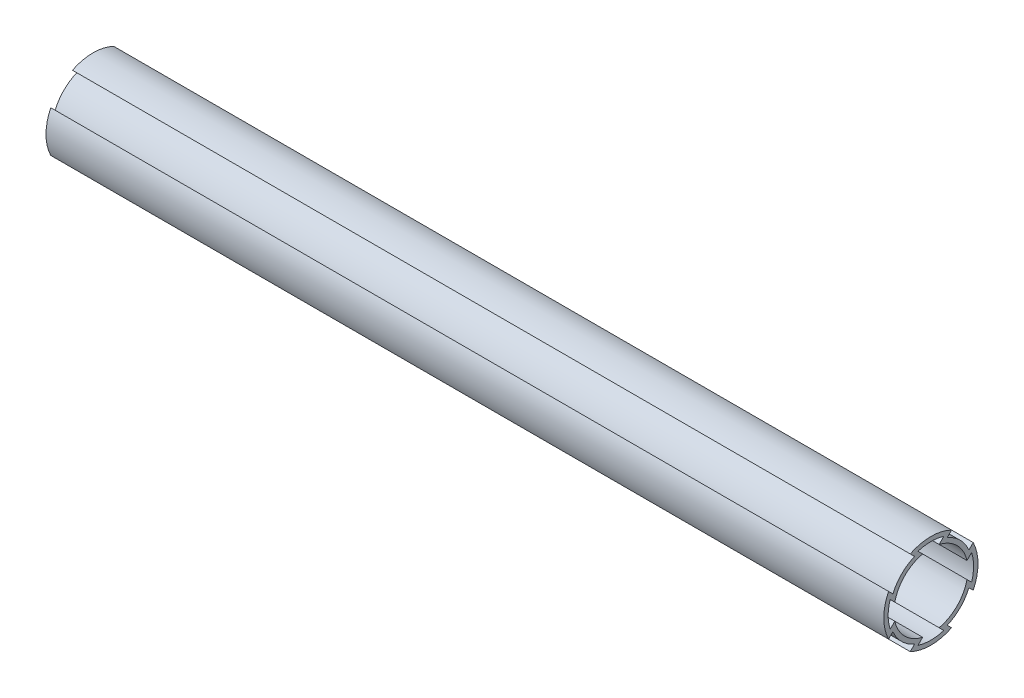
ISO-10303-21;
HEADER;
FILE_DESCRIPTION(('STEP AP214'),'2;1');
FILE_NAME('part.step','',(''),(''),'','','');
FILE_SCHEMA(('AUTOMOTIVE_DESIGN { 1 0 10303 214 1 1 1 1 }'));
ENDSEC;
DATA;
#1=APPLICATION_CONTEXT('core data for automotive mechanical design processes');
#2=APPLICATION_PROTOCOL_DEFINITION('international standard','automotive_design',2000,#1);
#3=PRODUCT_CONTEXT('',#1,'mechanical');
#4=PRODUCT('Part','Part','',(#3));
#5=PRODUCT_RELATED_PRODUCT_CATEGORY('part','',(#4));
#6=PRODUCT_DEFINITION_FORMATION('','',#4);
#7=PRODUCT_DEFINITION_CONTEXT('part definition',#1,'design');
#8=PRODUCT_DEFINITION('design','',#6,#7);
#9=PRODUCT_DEFINITION_SHAPE('','',#8);
#10=(LENGTH_UNIT() NAMED_UNIT(*) SI_UNIT(.MILLI.,.METRE.));
#11=(NAMED_UNIT(*) PLANE_ANGLE_UNIT() SI_UNIT($,.RADIAN.));
#12=(NAMED_UNIT(*) SI_UNIT($,.STERADIAN.) SOLID_ANGLE_UNIT());
#13=UNCERTAINTY_MEASURE_WITH_UNIT(LENGTH_MEASURE(1.E-05),#10,'distance_accuracy_value','');
#14=(GEOMETRIC_REPRESENTATION_CONTEXT(3) GLOBAL_UNCERTAINTY_ASSIGNED_CONTEXT((#13)) GLOBAL_UNIT_ASSIGNED_CONTEXT((#10,
#11,#12)) REPRESENTATION_CONTEXT('',''));
#15=CARTESIAN_POINT('',(0.,0.,0.));
#16=DIRECTION('',(0.,0.,1.));
#17=DIRECTION('',(1.,0.,0.));
#18=AXIS2_PLACEMENT_3D('',#15,#16,#17);
#19=CARTESIAN_POINT('',(249.,0.,0.));
#20=DIRECTION('',(1.,0.,0.));
#21=DIRECTION('',(0.,0.,-1.));
#22=AXIS2_PLACEMENT_3D('',#19,#20,#21);
#23=PLANE('',#22);
#24=CARTESIAN_POINT('',(249.,0.,0.));
#25=DIRECTION('',(1.,0.,0.));
#26=DIRECTION('',(0.,0.,-1.));
#27=AXIS2_PLACEMENT_3D('',#24,#25,#26);
#28=CIRCLE('',#27,12.3);
#29=CARTESIAN_POINT('',(249.,11.297790668331,4.86311895953339));
#30=VERTEX_POINT('',#29);
#31=CARTESIAN_POINT('',(249.,4.86311895953343,11.297790668331));
#32=VERTEX_POINT('',#31);
#33=EDGE_CURVE('E425',#30,#32,#28,.T.);
#34=ORIENTED_EDGE('',*,*,#33,.T.);
#35=DIRECTION('',(0.,0.707106781186547,0.707106781186547));
#36=VECTOR('',#35,1.);
#37=CARTESIAN_POINT('',(249.,4.86311895953343,11.297790668331));
#38=LINE('',#37,#36);
#39=CARTESIAN_POINT('',(249.,6.14475525816791,12.5794269669654));
#40=VERTEX_POINT('',#39);
#41=EDGE_CURVE('E429',#32,#40,#38,.T.);
#42=ORIENTED_EDGE('',*,*,#41,.T.);
#43=CARTESIAN_POINT('',(249.,0.,0.));
#44=DIRECTION('',(1.,0.,0.));
#45=DIRECTION('',(0.,0.,-1.));
#46=AXIS2_PLACEMENT_3D('',#43,#44,#45);
#47=CIRCLE('',#46,14.);
#48=CARTESIAN_POINT('',(249.,-6.14475525816791,12.5794269669654));
#49=VERTEX_POINT('',#48);
#50=EDGE_CURVE('E433',#40,#49,#47,.T.);
#51=ORIENTED_EDGE('',*,*,#50,.T.);
#52=DIRECTION('',(0.,0.707106781186548,-0.707106781186548));
#53=VECTOR('',#52,1.);
#54=CARTESIAN_POINT('',(249.,-6.14475525816792,12.5794269669654));
#55=LINE('',#54,#53);
#56=CARTESIAN_POINT('',(249.,-4.86311895953345,11.297790668331));
#57=VERTEX_POINT('',#56);
#58=EDGE_CURVE('E436',#49,#57,#55,.T.);
#59=ORIENTED_EDGE('',*,*,#58,.T.);
#60=CARTESIAN_POINT('',(249.,0.,0.));
#61=DIRECTION('',(1.,0.,0.));
#62=DIRECTION('',(0.,0.,-1.));
#63=AXIS2_PLACEMENT_3D('',#60,#61,#62);
#64=CIRCLE('',#63,12.3);
#65=CARTESIAN_POINT('',(249.,-11.297790668331,4.8631189595334));
#66=VERTEX_POINT('',#65);
#67=EDGE_CURVE('E439',#57,#66,#64,.T.);
#68=ORIENTED_EDGE('',*,*,#67,.T.);
#69=DIRECTION('',(0.,-0.707106781186547,0.707106781186547));
#70=VECTOR('',#69,1.);
#71=CARTESIAN_POINT('',(249.,-11.297790668331,4.86311895953339));
#72=LINE('',#71,#70);
#73=CARTESIAN_POINT('',(249.,-12.5794269669655,6.14475525816789));
#74=VERTEX_POINT('',#73);
#75=EDGE_CURVE('E442',#66,#74,#72,.T.);
#76=ORIENTED_EDGE('',*,*,#75,.T.);
#77=CARTESIAN_POINT('',(249.,0.,0.));
#78=DIRECTION('',(1.,0.,0.));
#79=DIRECTION('',(0.,0.,-1.));
#80=AXIS2_PLACEMENT_3D('',#77,#78,#79);
#81=CIRCLE('',#80,14.);
#82=CARTESIAN_POINT('',(249.,-12.5794269669655,-6.14475525816788));
#83=VERTEX_POINT('',#82);
#84=EDGE_CURVE('E445',#74,#83,#81,.T.);
#85=ORIENTED_EDGE('',*,*,#84,.T.);
#86=DIRECTION('',(0.,0.707106781186548,0.707106781186548));
#87=VECTOR('',#86,1.);
#88=CARTESIAN_POINT('',(249.,-12.5794269669655,-6.14475525816788));
#89=LINE('',#88,#87);
#90=CARTESIAN_POINT('',(249.,-11.297790668331,-4.86311895953338));
#91=VERTEX_POINT('',#90);
#92=EDGE_CURVE('E448',#83,#91,#89,.T.);
#93=ORIENTED_EDGE('',*,*,#92,.T.);
#94=CARTESIAN_POINT('',(249.,0.,0.));
#95=DIRECTION('',(1.,0.,0.));
#96=DIRECTION('',(0.,0.,-1.));
#97=AXIS2_PLACEMENT_3D('',#94,#95,#96);
#98=CIRCLE('',#97,12.3);
#99=CARTESIAN_POINT('',(249.,-4.86311895953344,-11.297790668331));
#100=VERTEX_POINT('',#99);
#101=EDGE_CURVE('E451',#91,#100,#98,.T.);
#102=ORIENTED_EDGE('',*,*,#101,.T.);
#103=DIRECTION('',(0.,-0.707106781186548,-0.707106781186548));
#104=VECTOR('',#103,1.);
#105=CARTESIAN_POINT('',(249.,-4.86311895953344,-11.297790668331));
#106=LINE('',#105,#104);
#107=CARTESIAN_POINT('',(249.,-6.14475525816793,-12.5794269669654));
#108=VERTEX_POINT('',#107);
#109=EDGE_CURVE('E454',#100,#108,#106,.T.);
#110=ORIENTED_EDGE('',*,*,#109,.T.);
#111=CARTESIAN_POINT('',(249.,0.,0.));
#112=DIRECTION('',(1.,0.,0.));
#113=DIRECTION('',(0.,0.,-1.));
#114=AXIS2_PLACEMENT_3D('',#111,#112,#113);
#115=CIRCLE('',#114,14.);
#116=CARTESIAN_POINT('',(249.,6.14475525816793,-12.5794269669654));
#117=VERTEX_POINT('',#116);
#118=EDGE_CURVE('E457',#108,#117,#115,.T.);
#119=ORIENTED_EDGE('',*,*,#118,.T.);
#120=DIRECTION('',(0.,-0.707106781186548,0.707106781186548));
#121=VECTOR('',#120,1.);
#122=CARTESIAN_POINT('',(249.,6.14475525816792,-12.5794269669654));
#123=LINE('',#122,#121);
#124=CARTESIAN_POINT('',(249.,4.86311895953344,-11.297790668331));
#125=VERTEX_POINT('',#124);
#126=EDGE_CURVE('E460',#117,#125,#123,.T.);
#127=ORIENTED_EDGE('',*,*,#126,.T.);
#128=CARTESIAN_POINT('',(249.,0.,0.));
#129=DIRECTION('',(1.,0.,0.));
#130=DIRECTION('',(0.,0.,-1.));
#131=AXIS2_PLACEMENT_3D('',#128,#129,#130);
#132=CIRCLE('',#131,12.3);
#133=CARTESIAN_POINT('',(249.,11.297790668331,-4.86311895953339));
#134=VERTEX_POINT('',#133);
#135=EDGE_CURVE('E463',#125,#134,#132,.T.);
#136=ORIENTED_EDGE('',*,*,#135,.T.);
#137=DIRECTION('',(0.,0.707106781186548,-0.707106781186548));
#138=VECTOR('',#137,1.);
#139=CARTESIAN_POINT('',(249.,11.297790668331,-4.86311895953339));
#140=LINE('',#139,#138);
#141=CARTESIAN_POINT('',(249.,12.5794269669655,-6.14475525816788));
#142=VERTEX_POINT('',#141);
#143=EDGE_CURVE('E466',#134,#142,#140,.T.);
#144=ORIENTED_EDGE('',*,*,#143,.T.);
#145=CARTESIAN_POINT('',(249.,0.,0.));
#146=DIRECTION('',(1.,0.,0.));
#147=DIRECTION('',(0.,0.,-1.));
#148=AXIS2_PLACEMENT_3D('',#145,#146,#147);
#149=CIRCLE('',#148,14.);
#150=CARTESIAN_POINT('',(249.,12.5794269669655,6.14475525816788));
#151=VERTEX_POINT('',#150);
#152=EDGE_CURVE('E469',#142,#151,#149,.T.);
#153=ORIENTED_EDGE('',*,*,#152,.T.);
#154=DIRECTION('',(0.,-0.707106781186547,-0.707106781186547));
#155=VECTOR('',#154,1.);
#156=CARTESIAN_POINT('',(249.,12.5794269669655,6.14475525816788));
#157=LINE('',#156,#155);
#158=EDGE_CURVE('E472',#151,#30,#157,.T.);
#159=ORIENTED_EDGE('',*,*,#158,.T.);
#160=EDGE_LOOP('',(#34,#42,#51,#59,#68,#76,#85,#93,#102,#110,#119,#127,#136,#144,#153,#159));
#161=FACE_BOUND('',#160,.T.);
#162=DIRECTION('',(0.,0.707106781186547,0.707106781186547));
#163=VECTOR('',#162,1.);
#164=CARTESIAN_POINT('',(249.,2.45043906922765,10.7235884091102));
#165=LINE('',#164,#163);
#166=CARTESIAN_POINT('',(249.,2.45043906922765,10.7235884091102));
#167=VERTEX_POINT('',#166);
#168=CARTESIAN_POINT('',(249.,3.834231437348,12.1073807772306));
#169=VERTEX_POINT('',#168);
#170=EDGE_CURVE('E264',#167,#169,#165,.T.);
#171=ORIENTED_EDGE('',*,*,#170,.F.);
#172=CARTESIAN_POINT('',(249.,0.,0.));
#173=DIRECTION('',(1.,0.,0.));
#174=DIRECTION('',(0.,0.,-1.));
#175=AXIS2_PLACEMENT_3D('',#172,#173,#174);
#176=CIRCLE('',#175,11.);
#177=CARTESIAN_POINT('',(249.,10.7235884091102,2.45043906922759));
#178=VERTEX_POINT('',#177);
#179=EDGE_CURVE('E255',#178,#167,#176,.T.);
#180=ORIENTED_EDGE('',*,*,#179,.F.);
#181=DIRECTION('',(0.,-0.707106781186548,-0.707106781186547));
#182=VECTOR('',#181,1.);
#183=CARTESIAN_POINT('',(249.,12.1073807772306,3.83423143734796));
#184=LINE('',#183,#182);
#185=CARTESIAN_POINT('',(249.,12.1073807772306,3.83423143734796));
#186=VERTEX_POINT('',#185);
#187=EDGE_CURVE('E320',#186,#178,#184,.T.);
#188=ORIENTED_EDGE('',*,*,#187,.F.);
#189=CARTESIAN_POINT('',(249.,0.,0.));
#190=DIRECTION('',(1.,0.,0.));
#191=DIRECTION('',(0.,0.,-1.));
#192=AXIS2_PLACEMENT_3D('',#189,#190,#191);
#193=CIRCLE('',#192,12.7);
#194=CARTESIAN_POINT('',(249.,12.1073807772306,-3.83423143734796));
#195=VERTEX_POINT('',#194);
#196=EDGE_CURVE('E317',#195,#186,#193,.T.);
#197=ORIENTED_EDGE('',*,*,#196,.F.);
#198=DIRECTION('',(0.,0.707106781186547,-0.707106781186548));
#199=VECTOR('',#198,1.);
#200=CARTESIAN_POINT('',(249.,10.7235884091102,-2.45043906922759));
#201=LINE('',#200,#199);
#202=CARTESIAN_POINT('',(249.,10.7235884091102,-2.45043906922759));
#203=VERTEX_POINT('',#202);
#204=EDGE_CURVE('E314',#203,#195,#201,.T.);
#205=ORIENTED_EDGE('',*,*,#204,.F.);
#206=CARTESIAN_POINT('',(249.,0.,0.));
#207=DIRECTION('',(1.,0.,0.));
#208=DIRECTION('',(0.,0.,-1.));
#209=AXIS2_PLACEMENT_3D('',#206,#207,#208);
#210=CIRCLE('',#209,11.);
#211=CARTESIAN_POINT('',(249.,2.45043906922765,-10.7235884091102));
#212=VERTEX_POINT('',#211);
#213=EDGE_CURVE('E311',#212,#203,#210,.T.);
#214=ORIENTED_EDGE('',*,*,#213,.F.);
#215=DIRECTION('',(0.,-0.707106781186547,0.707106781186548));
#216=VECTOR('',#215,1.);
#217=CARTESIAN_POINT('',(249.,3.83423143734802,-12.1073807772306));
#218=LINE('',#217,#216);
#219=CARTESIAN_POINT('',(249.,3.83423143734802,-12.1073807772306));
#220=VERTEX_POINT('',#219);
#221=EDGE_CURVE('E308',#220,#212,#218,.T.);
#222=ORIENTED_EDGE('',*,*,#221,.F.);
#223=CARTESIAN_POINT('',(249.,0.,0.));
#224=DIRECTION('',(1.,0.,0.));
#225=DIRECTION('',(0.,0.,-1.));
#226=AXIS2_PLACEMENT_3D('',#223,#224,#225);
#227=CIRCLE('',#226,12.7);
#228=CARTESIAN_POINT('',(249.,-3.83423143734802,-12.1073807772306));
#229=VERTEX_POINT('',#228);
#230=EDGE_CURVE('E305',#229,#220,#227,.T.);
#231=ORIENTED_EDGE('',*,*,#230,.F.);
#232=DIRECTION('',(0.,-0.707106781186547,-0.707106781186547));
#233=VECTOR('',#232,1.);
#234=CARTESIAN_POINT('',(249.,-2.45043906922765,-10.7235884091102));
#235=LINE('',#234,#233);
#236=CARTESIAN_POINT('',(249.,-2.45043906922766,-10.7235884091102));
#237=VERTEX_POINT('',#236);
#238=EDGE_CURVE('E302',#237,#229,#235,.T.);
#239=ORIENTED_EDGE('',*,*,#238,.F.);
#240=CARTESIAN_POINT('',(249.,0.,0.));
#241=DIRECTION('',(1.,0.,0.));
#242=DIRECTION('',(0.,0.,-1.));
#243=AXIS2_PLACEMENT_3D('',#240,#241,#242);
#244=CIRCLE('',#243,11.);
#245=CARTESIAN_POINT('',(249.,-10.7235884091102,-2.45043906922758));
#246=VERTEX_POINT('',#245);
#247=EDGE_CURVE('E299',#246,#237,#244,.T.);
#248=ORIENTED_EDGE('',*,*,#247,.F.);
#249=DIRECTION('',(0.,0.707106781186547,0.707106781186548));
#250=VECTOR('',#249,1.);
#251=CARTESIAN_POINT('',(249.,-12.1073807772306,-3.83423143734796));
#252=LINE('',#251,#250);
#253=CARTESIAN_POINT('',(249.,-12.1073807772306,-3.83423143734796));
#254=VERTEX_POINT('',#253);
#255=EDGE_CURVE('E296',#254,#246,#252,.T.);
#256=ORIENTED_EDGE('',*,*,#255,.F.);
#257=CARTESIAN_POINT('',(249.,0.,0.));
#258=DIRECTION('',(1.,0.,0.));
#259=DIRECTION('',(0.,0.,-1.));
#260=AXIS2_PLACEMENT_3D('',#257,#258,#259);
#261=CIRCLE('',#260,12.7);
#262=CARTESIAN_POINT('',(249.,-12.1073807772306,3.83423143734798));
#263=VERTEX_POINT('',#262);
#264=EDGE_CURVE('E293',#263,#254,#261,.T.);
#265=ORIENTED_EDGE('',*,*,#264,.F.);
#266=DIRECTION('',(0.,-0.707106781186548,0.707106781186548));
#267=VECTOR('',#266,1.);
#268=CARTESIAN_POINT('',(249.,-10.7235884091102,2.4504390692276));
#269=LINE('',#268,#267);
#270=CARTESIAN_POINT('',(249.,-10.7235884091102,2.4504390692276));
#271=VERTEX_POINT('',#270);
#272=EDGE_CURVE('E290',#271,#263,#269,.T.);
#273=ORIENTED_EDGE('',*,*,#272,.F.);
#274=CARTESIAN_POINT('',(249.,0.,0.));
#275=DIRECTION('',(1.,0.,0.));
#276=DIRECTION('',(0.,0.,-1.));
#277=AXIS2_PLACEMENT_3D('',#274,#275,#276);
#278=CIRCLE('',#277,11.);
#279=CARTESIAN_POINT('',(249.,-2.45043906922766,10.7235884091102));
#280=VERTEX_POINT('',#279);
#281=EDGE_CURVE('E287',#280,#271,#278,.T.);
#282=ORIENTED_EDGE('',*,*,#281,.F.);
#283=DIRECTION('',(0.,0.707106781186547,-0.707106781186548));
#284=VECTOR('',#283,1.);
#285=CARTESIAN_POINT('',(249.,-3.83423143734801,12.1073807772306));
#286=LINE('',#285,#284);
#287=CARTESIAN_POINT('',(249.,-3.83423143734801,12.1073807772306));
#288=VERTEX_POINT('',#287);
#289=EDGE_CURVE('E282',#288,#280,#286,.T.);
#290=ORIENTED_EDGE('',*,*,#289,.F.);
#291=CARTESIAN_POINT('',(249.,0.,0.));
#292=DIRECTION('',(1.,0.,0.));
#293=DIRECTION('',(0.,0.,-1.));
#294=AXIS2_PLACEMENT_3D('',#291,#292,#293);
#295=CIRCLE('',#294,12.7);
#296=EDGE_CURVE('E278',#169,#288,#295,.T.);
#297=ORIENTED_EDGE('',*,*,#296,.F.);
#298=EDGE_LOOP('',(#171,#180,#188,#197,#205,#214,#222,#231,#239,#248,#256,#265,#273,#282,#290,#297));
#299=FACE_BOUND('',#298,.T.);
#300=ADVANCED_FACE('F45',(#161,#299),#23,.T.);
#301=CARTESIAN_POINT('',(0.,0.,0.));
#302=DIRECTION('',(1.,0.,0.));
#303=DIRECTION('',(0.,0.,-1.));
#304=AXIS2_PLACEMENT_3D('',#301,#302,#303);
#305=PLANE('',#304);
#306=CARTESIAN_POINT('',(0.,0.,0.));
#307=DIRECTION('',(1.,0.,0.));
#308=DIRECTION('',(0.,0.,-1.));
#309=AXIS2_PLACEMENT_3D('',#306,#307,#308);
#310=CIRCLE('',#309,12.3);
#311=CARTESIAN_POINT('',(0.,11.297790668331,4.86311895953339));
#312=VERTEX_POINT('',#311);
#313=CARTESIAN_POINT('',(0.,4.86311895953343,11.297790668331));
#314=VERTEX_POINT('',#313);
#315=EDGE_CURVE('E273',#312,#314,#310,.T.);
#316=ORIENTED_EDGE('',*,*,#315,.F.);
#317=DIRECTION('',(0.,-0.707106781186547,-0.707106781186547));
#318=VECTOR('',#317,1.);
#319=CARTESIAN_POINT('',(0.,12.5794269669655,6.14475525816788));
#320=LINE('',#319,#318);
#321=CARTESIAN_POINT('',(0.,12.5794269669655,6.14475525816788));
#322=VERTEX_POINT('',#321);
#323=EDGE_CURVE('E430',#322,#312,#320,.T.);
#324=ORIENTED_EDGE('',*,*,#323,.F.);
#325=CARTESIAN_POINT('',(0.,0.,0.));
#326=DIRECTION('',(1.,0.,0.));
#327=DIRECTION('',(0.,0.,-1.));
#328=AXIS2_PLACEMENT_3D('',#325,#326,#327);
#329=CIRCLE('',#328,14.);
#330=CARTESIAN_POINT('',(0.,12.5794269669655,-6.14475525816788));
#331=VERTEX_POINT('',#330);
#332=EDGE_CURVE('E519',#331,#322,#329,.T.);
#333=ORIENTED_EDGE('',*,*,#332,.F.);
#334=DIRECTION('',(0.,0.707106781186548,-0.707106781186548));
#335=VECTOR('',#334,1.);
#336=CARTESIAN_POINT('',(0.,11.297790668331,-4.86311895953339));
#337=LINE('',#336,#335);
#338=CARTESIAN_POINT('',(0.,11.297790668331,-4.86311895953339));
#339=VERTEX_POINT('',#338);
#340=EDGE_CURVE('E516',#339,#331,#337,.T.);
#341=ORIENTED_EDGE('',*,*,#340,.F.);
#342=CARTESIAN_POINT('',(0.,0.,0.));
#343=DIRECTION('',(1.,0.,0.));
#344=DIRECTION('',(0.,0.,-1.));
#345=AXIS2_PLACEMENT_3D('',#342,#343,#344);
#346=CIRCLE('',#345,12.3);
#347=CARTESIAN_POINT('',(0.,4.86311895953344,-11.297790668331));
#348=VERTEX_POINT('',#347);
#349=EDGE_CURVE('E513',#348,#339,#346,.T.);
#350=ORIENTED_EDGE('',*,*,#349,.F.);
#351=DIRECTION('',(0.,-0.707106781186548,0.707106781186548));
#352=VECTOR('',#351,1.);
#353=CARTESIAN_POINT('',(0.,6.14475525816792,-12.5794269669654));
#354=LINE('',#353,#352);
#355=CARTESIAN_POINT('',(0.,6.14475525816793,-12.5794269669654));
#356=VERTEX_POINT('',#355);
#357=EDGE_CURVE('E510',#356,#348,#354,.T.);
#358=ORIENTED_EDGE('',*,*,#357,.F.);
#359=CARTESIAN_POINT('',(0.,0.,0.));
#360=DIRECTION('',(1.,0.,0.));
#361=DIRECTION('',(0.,0.,-1.));
#362=AXIS2_PLACEMENT_3D('',#359,#360,#361);
#363=CIRCLE('',#362,14.);
#364=CARTESIAN_POINT('',(0.,-6.14475525816793,-12.5794269669654));
#365=VERTEX_POINT('',#364);
#366=EDGE_CURVE('E507',#365,#356,#363,.T.);
#367=ORIENTED_EDGE('',*,*,#366,.F.);
#368=DIRECTION('',(0.,-0.707106781186548,-0.707106781186548));
#369=VECTOR('',#368,1.);
#370=CARTESIAN_POINT('',(0.,-4.86311895953344,-11.297790668331));
#371=LINE('',#370,#369);
#372=CARTESIAN_POINT('',(0.,-4.86311895953344,-11.297790668331));
#373=VERTEX_POINT('',#372);
#374=EDGE_CURVE('E503',#373,#365,#371,.T.);
#375=ORIENTED_EDGE('',*,*,#374,.F.);
#376=CARTESIAN_POINT('',(0.,0.,0.));
#377=DIRECTION('',(1.,0.,0.));
#378=DIRECTION('',(0.,0.,-1.));
#379=AXIS2_PLACEMENT_3D('',#376,#377,#378);
#380=CIRCLE('',#379,12.3);
#381=CARTESIAN_POINT('',(0.,-11.297790668331,-4.86311895953338));
#382=VERTEX_POINT('',#381);
#383=EDGE_CURVE('E500',#382,#373,#380,.T.);
#384=ORIENTED_EDGE('',*,*,#383,.F.);
#385=DIRECTION('',(0.,0.707106781186548,0.707106781186548));
#386=VECTOR('',#385,1.);
#387=CARTESIAN_POINT('',(0.,-12.5794269669655,-6.14475525816788));
#388=LINE('',#387,#386);
#389=CARTESIAN_POINT('',(0.,-12.5794269669655,-6.14475525816788));
#390=VERTEX_POINT('',#389);
#391=EDGE_CURVE('E497',#390,#382,#388,.T.);
#392=ORIENTED_EDGE('',*,*,#391,.F.);
#393=CARTESIAN_POINT('',(0.,0.,0.));
#394=DIRECTION('',(1.,0.,0.));
#395=DIRECTION('',(0.,0.,-1.));
#396=AXIS2_PLACEMENT_3D('',#393,#394,#395);
#397=CIRCLE('',#396,14.);
#398=CARTESIAN_POINT('',(0.,-12.5794269669655,6.14475525816789));
#399=VERTEX_POINT('',#398);
#400=EDGE_CURVE('E494',#399,#390,#397,.T.);
#401=ORIENTED_EDGE('',*,*,#400,.F.);
#402=DIRECTION('',(0.,-0.707106781186547,0.707106781186547));
#403=VECTOR('',#402,1.);
#404=CARTESIAN_POINT('',(0.,-11.297790668331,4.86311895953339));
#405=LINE('',#404,#403);
#406=CARTESIAN_POINT('',(0.,-11.297790668331,4.8631189595334));
#407=VERTEX_POINT('',#406);
#408=EDGE_CURVE('E491',#407,#399,#405,.T.);
#409=ORIENTED_EDGE('',*,*,#408,.F.);
#410=CARTESIAN_POINT('',(0.,0.,0.));
#411=DIRECTION('',(1.,0.,0.));
#412=DIRECTION('',(0.,0.,-1.));
#413=AXIS2_PLACEMENT_3D('',#410,#411,#412);
#414=CIRCLE('',#413,12.3);
#415=CARTESIAN_POINT('',(0.,-4.86311895953345,11.297790668331));
#416=VERTEX_POINT('',#415);
#417=EDGE_CURVE('E488',#416,#407,#414,.T.);
#418=ORIENTED_EDGE('',*,*,#417,.F.);
#419=DIRECTION('',(0.,0.707106781186548,-0.707106781186548));
#420=VECTOR('',#419,1.);
#421=CARTESIAN_POINT('',(0.,-6.14475525816792,12.5794269669654));
#422=LINE('',#421,#420);
#423=CARTESIAN_POINT('',(0.,-6.14475525816791,12.5794269669654));
#424=VERTEX_POINT('',#423);
#425=EDGE_CURVE('E485',#424,#416,#422,.T.);
#426=ORIENTED_EDGE('',*,*,#425,.F.);
#427=CARTESIAN_POINT('',(0.,0.,0.));
#428=DIRECTION('',(1.,0.,0.));
#429=DIRECTION('',(0.,0.,-1.));
#430=AXIS2_PLACEMENT_3D('',#427,#428,#429);
#431=CIRCLE('',#430,14.);
#432=CARTESIAN_POINT('',(0.,6.14475525816791,12.5794269669654));
#433=VERTEX_POINT('',#432);
#434=EDGE_CURVE('E482',#433,#424,#431,.T.);
#435=ORIENTED_EDGE('',*,*,#434,.F.);
#436=DIRECTION('',(0.,0.707106781186547,0.707106781186547));
#437=VECTOR('',#436,1.);
#438=CARTESIAN_POINT('',(0.,4.86311895953343,11.297790668331));
#439=LINE('',#438,#437);
#440=EDGE_CURVE('E479',#314,#433,#439,.T.);
#441=ORIENTED_EDGE('',*,*,#440,.F.);
#442=EDGE_LOOP('',(#316,#324,#333,#341,#350,#358,#367,#375,#384,#392,#401,#409,#418,#426,#435,#441));
#443=FACE_BOUND('',#442,.T.);
#444=CARTESIAN_POINT('',(0.,0.,0.));
#445=DIRECTION('',(1.,0.,0.));
#446=DIRECTION('',(0.,0.,-1.));
#447=AXIS2_PLACEMENT_3D('',#444,#445,#446);
#448=CIRCLE('',#447,11.);
#449=CARTESIAN_POINT('',(0.,10.7235884091102,2.45043906922759));
#450=VERTEX_POINT('',#449);
#451=CARTESIAN_POINT('',(0.,2.45043906922765,10.7235884091102));
#452=VERTEX_POINT('',#451);
#453=EDGE_CURVE('E69',#450,#452,#448,.T.);
#454=ORIENTED_EDGE('',*,*,#453,.T.);
#455=DIRECTION('',(0.,0.707106781186547,0.707106781186547));
#456=VECTOR('',#455,1.);
#457=CARTESIAN_POINT('',(0.,2.45043906922765,10.7235884091102));
#458=LINE('',#457,#456);
#459=CARTESIAN_POINT('',(0.,3.834231437348,12.1073807772306));
#460=VERTEX_POINT('',#459);
#461=EDGE_CURVE('E271',#452,#460,#458,.T.);
#462=ORIENTED_EDGE('',*,*,#461,.T.);
#463=CARTESIAN_POINT('',(0.,0.,0.));
#464=DIRECTION('',(1.,0.,0.));
#465=DIRECTION('',(0.,0.,-1.));
#466=AXIS2_PLACEMENT_3D('',#463,#464,#465);
#467=CIRCLE('',#466,12.7);
#468=CARTESIAN_POINT('',(0.,-3.83423143734801,12.1073807772306));
#469=VERTEX_POINT('',#468);
#470=EDGE_CURVE('E327',#460,#469,#467,.T.);
#471=ORIENTED_EDGE('',*,*,#470,.T.);
#472=DIRECTION('',(0.,0.707106781186547,-0.707106781186548));
#473=VECTOR('',#472,1.);
#474=CARTESIAN_POINT('',(0.,-3.83423143734801,12.1073807772306));
#475=LINE('',#474,#473);
#476=CARTESIAN_POINT('',(0.,-2.45043906922766,10.7235884091102));
#477=VERTEX_POINT('',#476);
#478=EDGE_CURVE('E331',#469,#477,#475,.T.);
#479=ORIENTED_EDGE('',*,*,#478,.T.);
#480=CARTESIAN_POINT('',(0.,0.,0.));
#481=DIRECTION('',(1.,0.,0.));
#482=DIRECTION('',(0.,0.,-1.));
#483=AXIS2_PLACEMENT_3D('',#480,#481,#482);
#484=CIRCLE('',#483,11.);
#485=CARTESIAN_POINT('',(0.,-10.7235884091102,2.4504390692276));
#486=VERTEX_POINT('',#485);
#487=EDGE_CURVE('E335',#477,#486,#484,.T.);
#488=ORIENTED_EDGE('',*,*,#487,.T.);
#489=DIRECTION('',(0.,-0.707106781186548,0.707106781186548));
#490=VECTOR('',#489,1.);
#491=CARTESIAN_POINT('',(0.,-10.7235884091102,2.4504390692276));
#492=LINE('',#491,#490);
#493=CARTESIAN_POINT('',(0.,-12.1073807772306,3.83423143734798));
#494=VERTEX_POINT('',#493);
#495=EDGE_CURVE('E339',#486,#494,#492,.T.);
#496=ORIENTED_EDGE('',*,*,#495,.T.);
#497=CARTESIAN_POINT('',(0.,0.,0.));
#498=DIRECTION('',(1.,0.,0.));
#499=DIRECTION('',(0.,0.,-1.));
#500=AXIS2_PLACEMENT_3D('',#497,#498,#499);
#501=CIRCLE('',#500,12.7);
#502=CARTESIAN_POINT('',(0.,-12.1073807772306,-3.83423143734796));
#503=VERTEX_POINT('',#502);
#504=EDGE_CURVE('E343',#494,#503,#501,.T.);
#505=ORIENTED_EDGE('',*,*,#504,.T.);
#506=DIRECTION('',(0.,0.707106781186547,0.707106781186548));
#507=VECTOR('',#506,1.);
#508=CARTESIAN_POINT('',(0.,-12.1073807772306,-3.83423143734796));
#509=LINE('',#508,#507);
#510=CARTESIAN_POINT('',(0.,-10.7235884091102,-2.45043906922758));
#511=VERTEX_POINT('',#510);
#512=EDGE_CURVE('E347',#503,#511,#509,.T.);
#513=ORIENTED_EDGE('',*,*,#512,.T.);
#514=CARTESIAN_POINT('',(0.,0.,0.));
#515=DIRECTION('',(1.,0.,0.));
#516=DIRECTION('',(0.,0.,-1.));
#517=AXIS2_PLACEMENT_3D('',#514,#515,#516);
#518=CIRCLE('',#517,11.);
#519=CARTESIAN_POINT('',(0.,-2.45043906922766,-10.7235884091102));
#520=VERTEX_POINT('',#519);
#521=EDGE_CURVE('E351',#511,#520,#518,.T.);
#522=ORIENTED_EDGE('',*,*,#521,.T.);
#523=DIRECTION('',(0.,-0.707106781186547,-0.707106781186547));
#524=VECTOR('',#523,1.);
#525=CARTESIAN_POINT('',(0.,-2.45043906922765,-10.7235884091102));
#526=LINE('',#525,#524);
#527=CARTESIAN_POINT('',(0.,-3.83423143734802,-12.1073807772306));
#528=VERTEX_POINT('',#527);
#529=EDGE_CURVE('E355',#520,#528,#526,.T.);
#530=ORIENTED_EDGE('',*,*,#529,.T.);
#531=CARTESIAN_POINT('',(0.,0.,0.));
#532=DIRECTION('',(1.,0.,0.));
#533=DIRECTION('',(0.,0.,-1.));
#534=AXIS2_PLACEMENT_3D('',#531,#532,#533);
#535=CIRCLE('',#534,12.7);
#536=CARTESIAN_POINT('',(0.,3.83423143734802,-12.1073807772306));
#537=VERTEX_POINT('',#536);
#538=EDGE_CURVE('E359',#528,#537,#535,.T.);
#539=ORIENTED_EDGE('',*,*,#538,.T.);
#540=DIRECTION('',(0.,-0.707106781186547,0.707106781186548));
#541=VECTOR('',#540,1.);
#542=CARTESIAN_POINT('',(0.,3.83423143734802,-12.1073807772306));
#543=LINE('',#542,#541);
#544=CARTESIAN_POINT('',(0.,2.45043906922765,-10.7235884091102));
#545=VERTEX_POINT('',#544);
#546=EDGE_CURVE('E363',#537,#545,#543,.T.);
#547=ORIENTED_EDGE('',*,*,#546,.T.);
#548=CARTESIAN_POINT('',(0.,0.,0.));
#549=DIRECTION('',(1.,0.,0.));
#550=DIRECTION('',(0.,0.,-1.));
#551=AXIS2_PLACEMENT_3D('',#548,#549,#550);
#552=CIRCLE('',#551,11.);
#553=CARTESIAN_POINT('',(0.,10.7235884091102,-2.45043906922759));
#554=VERTEX_POINT('',#553);
#555=EDGE_CURVE('E367',#545,#554,#552,.T.);
#556=ORIENTED_EDGE('',*,*,#555,.T.);
#557=DIRECTION('',(0.,0.707106781186547,-0.707106781186548));
#558=VECTOR('',#557,1.);
#559=CARTESIAN_POINT('',(0.,10.7235884091102,-2.45043906922759));
#560=LINE('',#559,#558);
#561=CARTESIAN_POINT('',(0.,12.1073807772306,-3.83423143734796));
#562=VERTEX_POINT('',#561);
#563=EDGE_CURVE('E371',#554,#562,#560,.T.);
#564=ORIENTED_EDGE('',*,*,#563,.T.);
#565=CARTESIAN_POINT('',(0.,0.,0.));
#566=DIRECTION('',(1.,0.,0.));
#567=DIRECTION('',(0.,0.,-1.));
#568=AXIS2_PLACEMENT_3D('',#565,#566,#567);
#569=CIRCLE('',#568,12.7);
#570=CARTESIAN_POINT('',(0.,12.1073807772306,3.83423143734796));
#571=VERTEX_POINT('',#570);
#572=EDGE_CURVE('E375',#562,#571,#569,.T.);
#573=ORIENTED_EDGE('',*,*,#572,.T.);
#574=DIRECTION('',(0.,-0.707106781186548,-0.707106781186547));
#575=VECTOR('',#574,1.);
#576=CARTESIAN_POINT('',(0.,12.1073807772306,3.83423143734796));
#577=LINE('',#576,#575);
#578=EDGE_CURVE('E265',#571,#450,#577,.T.);
#579=ORIENTED_EDGE('',*,*,#578,.T.);
#580=EDGE_LOOP('',(#454,#462,#471,#479,#488,#496,#505,#513,#522,#530,#539,#547,#556,#564,#573,#579));
#581=FACE_BOUND('',#580,.T.);
#582=ADVANCED_FACE('F590',(#443,#581),#305,.F.);
#583=CARTESIAN_POINT('',(249.,0.,0.));
#584=DIRECTION('',(-1.,0.,0.));
#585=DIRECTION('',(0.,0.,1.));
#586=AXIS2_PLACEMENT_3D('',#583,#584,#585);
#587=CYLINDRICAL_SURFACE('',#586,12.3);
#588=ORIENTED_EDGE('',*,*,#315,.T.);
#589=DIRECTION('',(-1.,0.,0.));
#590=VECTOR('',#589,1.);
#591=CARTESIAN_POINT('',(249.,4.86311895953343,11.297790668331));
#592=LINE('',#591,#590);
#593=EDGE_CURVE('E11',#32,#314,#592,.T.);
#594=ORIENTED_EDGE('',*,*,#593,.F.);
#595=ORIENTED_EDGE('',*,*,#33,.F.);
#596=DIRECTION('',(-1.,0.,0.));
#597=VECTOR('',#596,1.);
#598=CARTESIAN_POINT('',(249.,11.297790668331,4.86311895953339));
#599=LINE('',#598,#597);
#600=EDGE_CURVE('E475',#30,#312,#599,.T.);
#601=ORIENTED_EDGE('',*,*,#600,.T.);
#602=EDGE_LOOP('',(#588,#594,#595,#601));
#603=FACE_BOUND('',#602,.T.);
#604=ADVANCED_FACE('F47',(#603),#587,.T.);
#605=CARTESIAN_POINT('',(249.,4.86311895953343,11.297790668331));
#606=DIRECTION('',(0.,-0.707106781186547,0.707106781186547));
#607=DIRECTION('',(0.,-0.707106781186548,-0.707106781186548));
#608=AXIS2_PLACEMENT_3D('',#605,#606,#607);
#609=PLANE('',#608);
#610=ORIENTED_EDGE('',*,*,#440,.T.);
#611=DIRECTION('',(-1.,0.,0.));
#612=VECTOR('',#611,1.);
#613=CARTESIAN_POINT('',(249.,6.14475525816791,12.5794269669654));
#614=LINE('',#613,#612);
#615=EDGE_CURVE('E54',#40,#433,#614,.T.);
#616=ORIENTED_EDGE('',*,*,#615,.F.);
#617=ORIENTED_EDGE('',*,*,#41,.F.);
#618=ORIENTED_EDGE('',*,*,#593,.T.);
#619=EDGE_LOOP('',(#610,#616,#617,#618));
#620=FACE_BOUND('',#619,.T.);
#621=ADVANCED_FACE('F607',(#620),#609,.F.);
#622=CARTESIAN_POINT('',(249.,0.,0.));
#623=DIRECTION('',(-1.,0.,0.));
#624=DIRECTION('',(0.,0.,1.));
#625=AXIS2_PLACEMENT_3D('',#622,#623,#624);
#626=CYLINDRICAL_SURFACE('',#625,14.);
#627=ORIENTED_EDGE('',*,*,#434,.T.);
#628=DIRECTION('',(-1.,0.,0.));
#629=VECTOR('',#628,1.);
#630=CARTESIAN_POINT('',(249.,-6.14475525816791,12.5794269669654));
#631=LINE('',#630,#629);
#632=EDGE_CURVE('E575',#49,#424,#631,.T.);
#633=ORIENTED_EDGE('',*,*,#632,.F.);
#634=ORIENTED_EDGE('',*,*,#50,.F.);
#635=ORIENTED_EDGE('',*,*,#615,.T.);
#636=EDGE_LOOP('',(#627,#633,#634,#635));
#637=FACE_BOUND('',#636,.T.);
#638=ADVANCED_FACE('F584',(#637),#626,.T.);
#639=CARTESIAN_POINT('',(249.,-6.14475525816792,12.5794269669654));
#640=DIRECTION('',(0.,0.707106781186547,0.707106781186547));
#641=DIRECTION('',(0.,-0.707106781186548,0.707106781186548));
#642=AXIS2_PLACEMENT_3D('',#639,#640,#641);
#643=PLANE('',#642);
#644=ORIENTED_EDGE('',*,*,#425,.T.);
#645=DIRECTION('',(-1.,0.,0.));
#646=VECTOR('',#645,1.);
#647=CARTESIAN_POINT('',(249.,-4.86311895953345,11.297790668331));
#648=LINE('',#647,#646);
#649=EDGE_CURVE('E571',#57,#416,#648,.T.);
#650=ORIENTED_EDGE('',*,*,#649,.F.);
#651=ORIENTED_EDGE('',*,*,#58,.F.);
#652=ORIENTED_EDGE('',*,*,#632,.T.);
#653=EDGE_LOOP('',(#644,#650,#651,#652));
#654=FACE_BOUND('',#653,.T.);
#655=ADVANCED_FACE('F596',(#654),#643,.F.);
#656=CARTESIAN_POINT('',(249.,0.,0.));
#657=DIRECTION('',(-1.,0.,0.));
#658=DIRECTION('',(0.,0.,1.));
#659=AXIS2_PLACEMENT_3D('',#656,#657,#658);
#660=CYLINDRICAL_SURFACE('',#659,12.3);
#661=ORIENTED_EDGE('',*,*,#417,.T.);
#662=DIRECTION('',(-1.,0.,0.));
#663=VECTOR('',#662,1.);
#664=CARTESIAN_POINT('',(249.,-11.297790668331,4.8631189595334));
#665=LINE('',#664,#663);
#666=EDGE_CURVE('E567',#66,#407,#665,.T.);
#667=ORIENTED_EDGE('',*,*,#666,.F.);
#668=ORIENTED_EDGE('',*,*,#67,.F.);
#669=ORIENTED_EDGE('',*,*,#649,.T.);
#670=EDGE_LOOP('',(#661,#667,#668,#669));
#671=FACE_BOUND('',#670,.T.);
#672=ADVANCED_FACE('F600',(#671),#660,.T.);
#673=CARTESIAN_POINT('',(249.,-11.297790668331,4.86311895953339));
#674=DIRECTION('',(0.,-0.707106781186547,-0.707106781186547));
#675=DIRECTION('',(0.,0.707106781186548,-0.707106781186548));
#676=AXIS2_PLACEMENT_3D('',#673,#674,#675);
#677=PLANE('',#676);
#678=ORIENTED_EDGE('',*,*,#408,.T.);
#679=DIRECTION('',(-1.,0.,0.));
#680=VECTOR('',#679,1.);
#681=CARTESIAN_POINT('',(249.,-12.5794269669655,6.14475525816789));
#682=LINE('',#681,#680);
#683=EDGE_CURVE('E563',#74,#399,#682,.T.);
#684=ORIENTED_EDGE('',*,*,#683,.F.);
#685=ORIENTED_EDGE('',*,*,#75,.F.);
#686=ORIENTED_EDGE('',*,*,#666,.T.);
#687=EDGE_LOOP('',(#678,#684,#685,#686));
#688=FACE_BOUND('',#687,.T.);
#689=ADVANCED_FACE('F659',(#688),#677,.F.);
#690=CARTESIAN_POINT('',(249.,0.,0.));
#691=DIRECTION('',(-1.,0.,0.));
#692=DIRECTION('',(0.,0.,1.));
#693=AXIS2_PLACEMENT_3D('',#690,#691,#692);
#694=CYLINDRICAL_SURFACE('',#693,14.);
#695=ORIENTED_EDGE('',*,*,#400,.T.);
#696=DIRECTION('',(-1.,0.,0.));
#697=VECTOR('',#696,1.);
#698=CARTESIAN_POINT('',(249.,-12.5794269669655,-6.14475525816788));
#699=LINE('',#698,#697);
#700=EDGE_CURVE('E559',#83,#390,#699,.T.);
#701=ORIENTED_EDGE('',*,*,#700,.F.);
#702=ORIENTED_EDGE('',*,*,#84,.F.);
#703=ORIENTED_EDGE('',*,*,#683,.T.);
#704=EDGE_LOOP('',(#695,#701,#702,#703));
#705=FACE_BOUND('',#704,.T.);
#706=ADVANCED_FACE('F657',(#705),#694,.T.);
#707=CARTESIAN_POINT('',(249.,-12.5794269669655,-6.14475525816788));
#708=DIRECTION('',(0.,-0.707106781186547,0.707106781186547));
#709=DIRECTION('',(0.,-0.707106781186548,-0.707106781186548));
#710=AXIS2_PLACEMENT_3D('',#707,#708,#709);
#711=PLANE('',#710);
#712=ORIENTED_EDGE('',*,*,#391,.T.);
#713=DIRECTION('',(-1.,0.,0.));
#714=VECTOR('',#713,1.);
#715=CARTESIAN_POINT('',(249.,-11.297790668331,-4.86311895953338));
#716=LINE('',#715,#714);
#717=EDGE_CURVE('E555',#91,#382,#716,.T.);
#718=ORIENTED_EDGE('',*,*,#717,.F.);
#719=ORIENTED_EDGE('',*,*,#92,.F.);
#720=ORIENTED_EDGE('',*,*,#700,.T.);
#721=EDGE_LOOP('',(#712,#718,#719,#720));
#722=FACE_BOUND('',#721,.T.);
#723=ADVANCED_FACE('F652',(#722),#711,.F.);
#724=CARTESIAN_POINT('',(249.,0.,0.));
#725=DIRECTION('',(-1.,0.,0.));
#726=DIRECTION('',(0.,0.,1.));
#727=AXIS2_PLACEMENT_3D('',#724,#725,#726);
#728=CYLINDRICAL_SURFACE('',#727,12.3);
#729=ORIENTED_EDGE('',*,*,#383,.T.);
#730=DIRECTION('',(-1.,0.,0.));
#731=VECTOR('',#730,1.);
#732=CARTESIAN_POINT('',(249.,-4.86311895953344,-11.297790668331));
#733=LINE('',#732,#731);
#734=EDGE_CURVE('E551',#100,#373,#733,.T.);
#735=ORIENTED_EDGE('',*,*,#734,.F.);
#736=ORIENTED_EDGE('',*,*,#101,.F.);
#737=ORIENTED_EDGE('',*,*,#717,.T.);
#738=EDGE_LOOP('',(#729,#735,#736,#737));
#739=FACE_BOUND('',#738,.T.);
#740=ADVANCED_FACE('F647',(#739),#728,.T.);
#741=CARTESIAN_POINT('',(249.,-4.86311895953344,-11.297790668331));
#742=DIRECTION('',(0.,0.707106781186547,-0.707106781186547));
#743=DIRECTION('',(0.,0.707106781186548,0.707106781186548));
#744=AXIS2_PLACEMENT_3D('',#741,#742,#743);
#745=PLANE('',#744);
#746=ORIENTED_EDGE('',*,*,#374,.T.);
#747=DIRECTION('',(-1.,0.,0.));
#748=VECTOR('',#747,1.);
#749=CARTESIAN_POINT('',(249.,-6.14475525816793,-12.5794269669654));
#750=LINE('',#749,#748);
#751=EDGE_CURVE('E547',#108,#365,#750,.T.);
#752=ORIENTED_EDGE('',*,*,#751,.F.);
#753=ORIENTED_EDGE('',*,*,#109,.F.);
#754=ORIENTED_EDGE('',*,*,#734,.T.);
#755=EDGE_LOOP('',(#746,#752,#753,#754));
#756=FACE_BOUND('',#755,.T.);
#757=ADVANCED_FACE('F642',(#756),#745,.F.);
#758=CARTESIAN_POINT('',(249.,0.,0.));
#759=DIRECTION('',(-1.,0.,0.));
#760=DIRECTION('',(0.,0.,1.));
#761=AXIS2_PLACEMENT_3D('',#758,#759,#760);
#762=CYLINDRICAL_SURFACE('',#761,14.);
#763=ORIENTED_EDGE('',*,*,#366,.T.);
#764=DIRECTION('',(-1.,0.,0.));
#765=VECTOR('',#764,1.);
#766=CARTESIAN_POINT('',(249.,6.14475525816793,-12.5794269669654));
#767=LINE('',#766,#765);
#768=EDGE_CURVE('E543',#117,#356,#767,.T.);
#769=ORIENTED_EDGE('',*,*,#768,.F.);
#770=ORIENTED_EDGE('',*,*,#118,.F.);
#771=ORIENTED_EDGE('',*,*,#751,.T.);
#772=EDGE_LOOP('',(#763,#769,#770,#771));
#773=FACE_BOUND('',#772,.T.);
#774=ADVANCED_FACE('F637',(#773),#762,.T.);
#775=CARTESIAN_POINT('',(249.,6.14475525816792,-12.5794269669654));
#776=DIRECTION('',(0.,-0.707106781186547,-0.707106781186547));
#777=DIRECTION('',(0.,0.707106781186548,-0.707106781186548));
#778=AXIS2_PLACEMENT_3D('',#775,#776,#777);
#779=PLANE('',#778);
#780=ORIENTED_EDGE('',*,*,#357,.T.);
#781=DIRECTION('',(-1.,0.,0.));
#782=VECTOR('',#781,1.);
#783=CARTESIAN_POINT('',(249.,4.86311895953344,-11.297790668331));
#784=LINE('',#783,#782);
#785=EDGE_CURVE('E539',#125,#348,#784,.T.);
#786=ORIENTED_EDGE('',*,*,#785,.F.);
#787=ORIENTED_EDGE('',*,*,#126,.F.);
#788=ORIENTED_EDGE('',*,*,#768,.T.);
#789=EDGE_LOOP('',(#780,#786,#787,#788));
#790=FACE_BOUND('',#789,.T.);
#791=ADVANCED_FACE('F633',(#790),#779,.F.);
#792=CARTESIAN_POINT('',(249.,0.,0.));
#793=DIRECTION('',(-1.,0.,0.));
#794=DIRECTION('',(0.,0.,1.));
#795=AXIS2_PLACEMENT_3D('',#792,#793,#794);
#796=CYLINDRICAL_SURFACE('',#795,12.3);
#797=ORIENTED_EDGE('',*,*,#349,.T.);
#798=DIRECTION('',(-1.,0.,0.));
#799=VECTOR('',#798,1.);
#800=CARTESIAN_POINT('',(249.,11.297790668331,-4.86311895953339));
#801=LINE('',#800,#799);
#802=EDGE_CURVE('E535',#134,#339,#801,.T.);
#803=ORIENTED_EDGE('',*,*,#802,.F.);
#804=ORIENTED_EDGE('',*,*,#135,.F.);
#805=ORIENTED_EDGE('',*,*,#785,.T.);
#806=EDGE_LOOP('',(#797,#803,#804,#805));
#807=FACE_BOUND('',#806,.T.);
#808=ADVANCED_FACE('F628',(#807),#796,.T.);
#809=CARTESIAN_POINT('',(249.,11.297790668331,-4.86311895953339));
#810=DIRECTION('',(0.,0.707106781186547,0.707106781186547));
#811=DIRECTION('',(0.,-0.707106781186548,0.707106781186548));
#812=AXIS2_PLACEMENT_3D('',#809,#810,#811);
#813=PLANE('',#812);
#814=ORIENTED_EDGE('',*,*,#340,.T.);
#815=DIRECTION('',(-1.,0.,0.));
#816=VECTOR('',#815,1.);
#817=CARTESIAN_POINT('',(249.,12.5794269669655,-6.14475525816788));
#818=LINE('',#817,#816);
#819=EDGE_CURVE('E531',#142,#331,#818,.T.);
#820=ORIENTED_EDGE('',*,*,#819,.F.);
#821=ORIENTED_EDGE('',*,*,#143,.F.);
#822=ORIENTED_EDGE('',*,*,#802,.T.);
#823=EDGE_LOOP('',(#814,#820,#821,#822));
#824=FACE_BOUND('',#823,.T.);
#825=ADVANCED_FACE('F623',(#824),#813,.F.);
#826=CARTESIAN_POINT('',(249.,0.,0.));
#827=DIRECTION('',(-1.,0.,0.));
#828=DIRECTION('',(0.,0.,1.));
#829=AXIS2_PLACEMENT_3D('',#826,#827,#828);
#830=CYLINDRICAL_SURFACE('',#829,14.);
#831=ORIENTED_EDGE('',*,*,#332,.T.);
#832=DIRECTION('',(-1.,0.,0.));
#833=VECTOR('',#832,1.);
#834=CARTESIAN_POINT('',(249.,12.5794269669655,6.14475525816788));
#835=LINE('',#834,#833);
#836=EDGE_CURVE('E527',#151,#322,#835,.T.);
#837=ORIENTED_EDGE('',*,*,#836,.F.);
#838=ORIENTED_EDGE('',*,*,#152,.F.);
#839=ORIENTED_EDGE('',*,*,#819,.T.);
#840=EDGE_LOOP('',(#831,#837,#838,#839));
#841=FACE_BOUND('',#840,.T.);
#842=ADVANCED_FACE('F619',(#841),#830,.T.);
#843=CARTESIAN_POINT('',(249.,12.5794269669655,6.14475525816788));
#844=DIRECTION('',(0.,0.707106781186547,-0.707106781186547));
#845=DIRECTION('',(0.,0.707106781186548,0.707106781186548));
#846=AXIS2_PLACEMENT_3D('',#843,#844,#845);
#847=PLANE('',#846);
#848=ORIENTED_EDGE('',*,*,#323,.T.);
#849=ORIENTED_EDGE('',*,*,#600,.F.);
#850=ORIENTED_EDGE('',*,*,#158,.F.);
#851=ORIENTED_EDGE('',*,*,#836,.T.);
#852=EDGE_LOOP('',(#848,#849,#850,#851));
#853=FACE_BOUND('',#852,.T.);
#854=ADVANCED_FACE('F614',(#853),#847,.F.);
#855=CARTESIAN_POINT('',(249.,0.,0.));
#856=DIRECTION('',(-1.,0.,0.));
#857=DIRECTION('',(0.,0.,1.));
#858=AXIS2_PLACEMENT_3D('',#855,#856,#857);
#859=CYLINDRICAL_SURFACE('',#858,11.);
#860=ORIENTED_EDGE('',*,*,#453,.F.);
#861=DIRECTION('',(-1.,0.,0.));
#862=VECTOR('',#861,1.);
#863=CARTESIAN_POINT('',(249.,10.7235884091102,2.45043906922759));
#864=LINE('',#863,#862);
#865=EDGE_CURVE('E259',#178,#450,#864,.T.);
#866=ORIENTED_EDGE('',*,*,#865,.F.);
#867=ORIENTED_EDGE('',*,*,#179,.T.);
#868=DIRECTION('',(-1.,0.,0.));
#869=VECTOR('',#868,1.);
#870=CARTESIAN_POINT('',(249.,2.45043906922765,10.7235884091102));
#871=LINE('',#870,#869);
#872=EDGE_CURVE('E258',#167,#452,#871,.T.);
#873=ORIENTED_EDGE('',*,*,#872,.T.);
#874=EDGE_LOOP('',(#860,#866,#867,#873));
#875=FACE_BOUND('',#874,.T.);
#876=ADVANCED_FACE('F257',(#875),#859,.F.);
#877=CARTESIAN_POINT('',(249.,2.45043906922765,10.7235884091102));
#878=DIRECTION('',(0.,-0.707106781186547,0.707106781186547));
#879=DIRECTION('',(0.,-0.707106781186548,-0.707106781186548));
#880=AXIS2_PLACEMENT_3D('',#877,#878,#879);
#881=PLANE('',#880);
#882=ORIENTED_EDGE('',*,*,#461,.F.);
#883=ORIENTED_EDGE('',*,*,#872,.F.);
#884=ORIENTED_EDGE('',*,*,#170,.T.);
#885=DIRECTION('',(-1.,0.,0.));
#886=VECTOR('',#885,1.);
#887=CARTESIAN_POINT('',(249.,3.834231437348,12.1073807772306));
#888=LINE('',#887,#886);
#889=EDGE_CURVE('E274',#169,#460,#888,.T.);
#890=ORIENTED_EDGE('',*,*,#889,.T.);
#891=EDGE_LOOP('',(#882,#883,#884,#890));
#892=FACE_BOUND('',#891,.T.);
#893=ADVANCED_FACE('F268',(#892),#881,.T.);
#894=CARTESIAN_POINT('',(249.,0.,0.));
#895=DIRECTION('',(-1.,0.,0.));
#896=DIRECTION('',(0.,0.,1.));
#897=AXIS2_PLACEMENT_3D('',#894,#895,#896);
#898=CYLINDRICAL_SURFACE('',#897,12.7);
#899=ORIENTED_EDGE('',*,*,#470,.F.);
#900=ORIENTED_EDGE('',*,*,#889,.F.);
#901=ORIENTED_EDGE('',*,*,#296,.T.);
#902=DIRECTION('',(-1.,0.,0.));
#903=VECTOR('',#902,1.);
#904=CARTESIAN_POINT('',(249.,-3.83423143734801,12.1073807772306));
#905=LINE('',#904,#903);
#906=EDGE_CURVE('E420',#288,#469,#905,.T.);
#907=ORIENTED_EDGE('',*,*,#906,.T.);
#908=EDGE_LOOP('',(#899,#900,#901,#907));
#909=FACE_BOUND('',#908,.T.);
#910=ADVANCED_FACE('F751',(#909),#898,.F.);
#911=CARTESIAN_POINT('',(249.,-3.83423143734801,12.1073807772306));
#912=DIRECTION('',(0.,0.707106781186548,0.707106781186547));
#913=DIRECTION('',(0.,-0.707106781186547,0.707106781186548));
#914=AXIS2_PLACEMENT_3D('',#911,#912,#913);
#915=PLANE('',#914);
#916=ORIENTED_EDGE('',*,*,#478,.F.);
#917=ORIENTED_EDGE('',*,*,#906,.F.);
#918=ORIENTED_EDGE('',*,*,#289,.T.);
#919=DIRECTION('',(-1.,0.,0.));
#920=VECTOR('',#919,1.);
#921=CARTESIAN_POINT('',(249.,-2.45043906922766,10.7235884091102));
#922=LINE('',#921,#920);
#923=EDGE_CURVE('E417',#280,#477,#922,.T.);
#924=ORIENTED_EDGE('',*,*,#923,.T.);
#925=EDGE_LOOP('',(#916,#917,#918,#924));
#926=FACE_BOUND('',#925,.T.);
#927=ADVANCED_FACE('F758',(#926),#915,.T.);
#928=CARTESIAN_POINT('',(249.,0.,0.));
#929=DIRECTION('',(-1.,0.,0.));
#930=DIRECTION('',(0.,0.,1.));
#931=AXIS2_PLACEMENT_3D('',#928,#929,#930);
#932=CYLINDRICAL_SURFACE('',#931,11.);
#933=ORIENTED_EDGE('',*,*,#487,.F.);
#934=ORIENTED_EDGE('',*,*,#923,.F.);
#935=ORIENTED_EDGE('',*,*,#281,.T.);
#936=DIRECTION('',(-1.,0.,0.));
#937=VECTOR('',#936,1.);
#938=CARTESIAN_POINT('',(249.,-10.7235884091102,2.4504390692276));
#939=LINE('',#938,#937);
#940=EDGE_CURVE('E414',#271,#486,#939,.T.);
#941=ORIENTED_EDGE('',*,*,#940,.T.);
#942=EDGE_LOOP('',(#933,#934,#935,#941));
#943=FACE_BOUND('',#942,.T.);
#944=ADVANCED_FACE('F767',(#943),#932,.F.);
#945=CARTESIAN_POINT('',(249.,-10.7235884091102,2.4504390692276));
#946=DIRECTION('',(0.,-0.707106781186547,-0.707106781186547));
#947=DIRECTION('',(0.,0.707106781186548,-0.707106781186548));
#948=AXIS2_PLACEMENT_3D('',#945,#946,#947);
#949=PLANE('',#948);
#950=ORIENTED_EDGE('',*,*,#495,.F.);
#951=ORIENTED_EDGE('',*,*,#940,.F.);
#952=ORIENTED_EDGE('',*,*,#272,.T.);
#953=DIRECTION('',(-1.,0.,0.));
#954=VECTOR('',#953,1.);
#955=CARTESIAN_POINT('',(249.,-12.1073807772306,3.83423143734798));
#956=LINE('',#955,#954);
#957=EDGE_CURVE('E411',#263,#494,#956,.T.);
#958=ORIENTED_EDGE('',*,*,#957,.T.);
#959=EDGE_LOOP('',(#950,#951,#952,#958));
#960=FACE_BOUND('',#959,.T.);
#961=ADVANCED_FACE('F776',(#960),#949,.T.);
#962=CARTESIAN_POINT('',(249.,0.,0.));
#963=DIRECTION('',(-1.,0.,0.));
#964=DIRECTION('',(0.,0.,1.));
#965=AXIS2_PLACEMENT_3D('',#962,#963,#964);
#966=CYLINDRICAL_SURFACE('',#965,12.7);
#967=ORIENTED_EDGE('',*,*,#504,.F.);
#968=ORIENTED_EDGE('',*,*,#957,.F.);
#969=ORIENTED_EDGE('',*,*,#264,.T.);
#970=DIRECTION('',(-1.,0.,0.));
#971=VECTOR('',#970,1.);
#972=CARTESIAN_POINT('',(249.,-12.1073807772306,-3.83423143734796));
#973=LINE('',#972,#971);
#974=EDGE_CURVE('E408',#254,#503,#973,.T.);
#975=ORIENTED_EDGE('',*,*,#974,.T.);
#976=EDGE_LOOP('',(#967,#968,#969,#975));
#977=FACE_BOUND('',#976,.T.);
#978=ADVANCED_FACE('F785',(#977),#966,.F.);
#979=CARTESIAN_POINT('',(249.,-12.1073807772306,-3.83423143734796));
#980=DIRECTION('',(0.,-0.707106781186548,0.707106781186547));
#981=DIRECTION('',(0.,-0.707106781186547,-0.707106781186548));
#982=AXIS2_PLACEMENT_3D('',#979,#980,#981);
#983=PLANE('',#982);
#984=ORIENTED_EDGE('',*,*,#512,.F.);
#985=ORIENTED_EDGE('',*,*,#974,.F.);
#986=ORIENTED_EDGE('',*,*,#255,.T.);
#987=DIRECTION('',(-1.,0.,0.));
#988=VECTOR('',#987,1.);
#989=CARTESIAN_POINT('',(249.,-10.7235884091102,-2.45043906922758));
#990=LINE('',#989,#988);
#991=EDGE_CURVE('E405',#246,#511,#990,.T.);
#992=ORIENTED_EDGE('',*,*,#991,.T.);
#993=EDGE_LOOP('',(#984,#985,#986,#992));
#994=FACE_BOUND('',#993,.T.);
#995=ADVANCED_FACE('F794',(#994),#983,.T.);
#996=CARTESIAN_POINT('',(249.,0.,0.));
#997=DIRECTION('',(-1.,0.,0.));
#998=DIRECTION('',(0.,0.,1.));
#999=AXIS2_PLACEMENT_3D('',#996,#997,#998);
#1000=CYLINDRICAL_SURFACE('',#999,11.);
#1001=ORIENTED_EDGE('',*,*,#521,.F.);
#1002=ORIENTED_EDGE('',*,*,#991,.F.);
#1003=ORIENTED_EDGE('',*,*,#247,.T.);
#1004=DIRECTION('',(-1.,0.,0.));
#1005=VECTOR('',#1004,1.);
#1006=CARTESIAN_POINT('',(249.,-2.45043906922766,-10.7235884091102));
#1007=LINE('',#1006,#1005);
#1008=EDGE_CURVE('E402',#237,#520,#1007,.T.);
#1009=ORIENTED_EDGE('',*,*,#1008,.T.);
#1010=EDGE_LOOP('',(#1001,#1002,#1003,#1009));
#1011=FACE_BOUND('',#1010,.T.);
#1012=ADVANCED_FACE('F803',(#1011),#1000,.F.);
#1013=CARTESIAN_POINT('',(249.,-2.45043906922765,-10.7235884091102));
#1014=DIRECTION('',(0.,0.707106781186547,-0.707106781186547));
#1015=DIRECTION('',(0.,0.707106781186548,0.707106781186548));
#1016=AXIS2_PLACEMENT_3D('',#1013,#1014,#1015);
#1017=PLANE('',#1016);
#1018=ORIENTED_EDGE('',*,*,#529,.F.);
#1019=ORIENTED_EDGE('',*,*,#1008,.F.);
#1020=ORIENTED_EDGE('',*,*,#238,.T.);
#1021=DIRECTION('',(-1.,0.,0.));
#1022=VECTOR('',#1021,1.);
#1023=CARTESIAN_POINT('',(249.,-3.83423143734802,-12.1073807772306));
#1024=LINE('',#1023,#1022);
#1025=EDGE_CURVE('E398',#229,#528,#1024,.T.);
#1026=ORIENTED_EDGE('',*,*,#1025,.T.);
#1027=EDGE_LOOP('',(#1018,#1019,#1020,#1026));
#1028=FACE_BOUND('',#1027,.T.);
#1029=ADVANCED_FACE('F812',(#1028),#1017,.T.);
#1030=CARTESIAN_POINT('',(249.,0.,0.));
#1031=DIRECTION('',(-1.,0.,0.));
#1032=DIRECTION('',(0.,0.,1.));
#1033=AXIS2_PLACEMENT_3D('',#1030,#1031,#1032);
#1034=CYLINDRICAL_SURFACE('',#1033,12.7);
#1035=ORIENTED_EDGE('',*,*,#538,.F.);
#1036=ORIENTED_EDGE('',*,*,#1025,.F.);
#1037=ORIENTED_EDGE('',*,*,#230,.T.);
#1038=DIRECTION('',(-1.,0.,0.));
#1039=VECTOR('',#1038,1.);
#1040=CARTESIAN_POINT('',(249.,3.83423143734802,-12.1073807772306));
#1041=LINE('',#1040,#1039);
#1042=EDGE_CURVE('E395',#220,#537,#1041,.T.);
#1043=ORIENTED_EDGE('',*,*,#1042,.T.);
#1044=EDGE_LOOP('',(#1035,#1036,#1037,#1043));
#1045=FACE_BOUND('',#1044,.T.);
#1046=ADVANCED_FACE('F821',(#1045),#1034,.F.);
#1047=CARTESIAN_POINT('',(249.,3.83423143734802,-12.1073807772306));
#1048=DIRECTION('',(0.,-0.707106781186548,-0.707106781186547));
#1049=DIRECTION('',(0.,0.707106781186547,-0.707106781186548));
#1050=AXIS2_PLACEMENT_3D('',#1047,#1048,#1049);
#1051=PLANE('',#1050);
#1052=ORIENTED_EDGE('',*,*,#546,.F.);
#1053=ORIENTED_EDGE('',*,*,#1042,.F.);
#1054=ORIENTED_EDGE('',*,*,#221,.T.);
#1055=DIRECTION('',(-1.,0.,0.));
#1056=VECTOR('',#1055,1.);
#1057=CARTESIAN_POINT('',(249.,2.45043906922765,-10.7235884091102));
#1058=LINE('',#1057,#1056);
#1059=EDGE_CURVE('E392',#212,#545,#1058,.T.);
#1060=ORIENTED_EDGE('',*,*,#1059,.T.);
#1061=EDGE_LOOP('',(#1052,#1053,#1054,#1060));
#1062=FACE_BOUND('',#1061,.T.);
#1063=ADVANCED_FACE('F831',(#1062),#1051,.T.);
#1064=CARTESIAN_POINT('',(249.,0.,0.));
#1065=DIRECTION('',(-1.,0.,0.));
#1066=DIRECTION('',(0.,0.,1.));
#1067=AXIS2_PLACEMENT_3D('',#1064,#1065,#1066);
#1068=CYLINDRICAL_SURFACE('',#1067,11.);
#1069=ORIENTED_EDGE('',*,*,#555,.F.);
#1070=ORIENTED_EDGE('',*,*,#1059,.F.);
#1071=ORIENTED_EDGE('',*,*,#213,.T.);
#1072=DIRECTION('',(-1.,0.,0.));
#1073=VECTOR('',#1072,1.);
#1074=CARTESIAN_POINT('',(249.,10.7235884091102,-2.45043906922759));
#1075=LINE('',#1074,#1073);
#1076=EDGE_CURVE('E389',#203,#554,#1075,.T.);
#1077=ORIENTED_EDGE('',*,*,#1076,.T.);
#1078=EDGE_LOOP('',(#1069,#1070,#1071,#1077));
#1079=FACE_BOUND('',#1078,.T.);
#1080=ADVANCED_FACE('F839',(#1079),#1068,.F.);
#1081=CARTESIAN_POINT('',(249.,10.7235884091102,-2.45043906922759));
#1082=DIRECTION('',(0.,0.707106781186548,0.707106781186547));
#1083=DIRECTION('',(0.,-0.707106781186547,0.707106781186548));
#1084=AXIS2_PLACEMENT_3D('',#1081,#1082,#1083);
#1085=PLANE('',#1084);
#1086=ORIENTED_EDGE('',*,*,#563,.F.);
#1087=ORIENTED_EDGE('',*,*,#1076,.F.);
#1088=ORIENTED_EDGE('',*,*,#204,.T.);
#1089=DIRECTION('',(-1.,0.,0.));
#1090=VECTOR('',#1089,1.);
#1091=CARTESIAN_POINT('',(249.,12.1073807772306,-3.83423143734796));
#1092=LINE('',#1091,#1090);
#1093=EDGE_CURVE('E386',#195,#562,#1092,.T.);
#1094=ORIENTED_EDGE('',*,*,#1093,.T.);
#1095=EDGE_LOOP('',(#1086,#1087,#1088,#1094));
#1096=FACE_BOUND('',#1095,.T.);
#1097=ADVANCED_FACE('F848',(#1096),#1085,.T.);
#1098=CARTESIAN_POINT('',(249.,0.,0.));
#1099=DIRECTION('',(-1.,0.,0.));
#1100=DIRECTION('',(0.,0.,1.));
#1101=AXIS2_PLACEMENT_3D('',#1098,#1099,#1100);
#1102=CYLINDRICAL_SURFACE('',#1101,12.7);
#1103=ORIENTED_EDGE('',*,*,#572,.F.);
#1104=ORIENTED_EDGE('',*,*,#1093,.F.);
#1105=ORIENTED_EDGE('',*,*,#196,.T.);
#1106=DIRECTION('',(-1.,0.,0.));
#1107=VECTOR('',#1106,1.);
#1108=CARTESIAN_POINT('',(249.,12.1073807772306,3.83423143734796));
#1109=LINE('',#1108,#1107);
#1110=EDGE_CURVE('E61',#186,#571,#1109,.T.);
#1111=ORIENTED_EDGE('',*,*,#1110,.T.);
#1112=EDGE_LOOP('',(#1103,#1104,#1105,#1111));
#1113=FACE_BOUND('',#1112,.T.);
#1114=ADVANCED_FACE('F857',(#1113),#1102,.F.);
#1115=CARTESIAN_POINT('',(249.,12.1073807772306,3.83423143734796));
#1116=DIRECTION('',(0.,0.707106781186547,-0.707106781186548));
#1117=DIRECTION('',(0.,0.707106781186548,0.707106781186547));
#1118=AXIS2_PLACEMENT_3D('',#1115,#1116,#1117);
#1119=PLANE('',#1118);
#1120=ORIENTED_EDGE('',*,*,#578,.F.);
#1121=ORIENTED_EDGE('',*,*,#1110,.F.);
#1122=ORIENTED_EDGE('',*,*,#187,.T.);
#1123=ORIENTED_EDGE('',*,*,#865,.T.);
#1124=EDGE_LOOP('',(#1120,#1121,#1122,#1123));
#1125=FACE_BOUND('',#1124,.T.);
#1126=ADVANCED_FACE('F866',(#1125),#1119,.T.);
#1127=CLOSED_SHELL('',(#300,#582,#604,#621,#638,#655,#672,#689,#706,#723,#740,#757,#774,#791,
#808,#825,#842,#854,#876,#893,#910,#927,#944,#961,#978,#995,#1012,#1029,#1046,#1063,#1080,#1097,
#1114,#1126));
#1128=MANIFOLD_SOLID_BREP('B2',#1127);
#1129=ADVANCED_BREP_SHAPE_REPRESENTATION('',(#18,#1128),#14);
#1130=SHAPE_DEFINITION_REPRESENTATION(#9,#1129);
ENDSEC;
END-ISO-10303-21;
